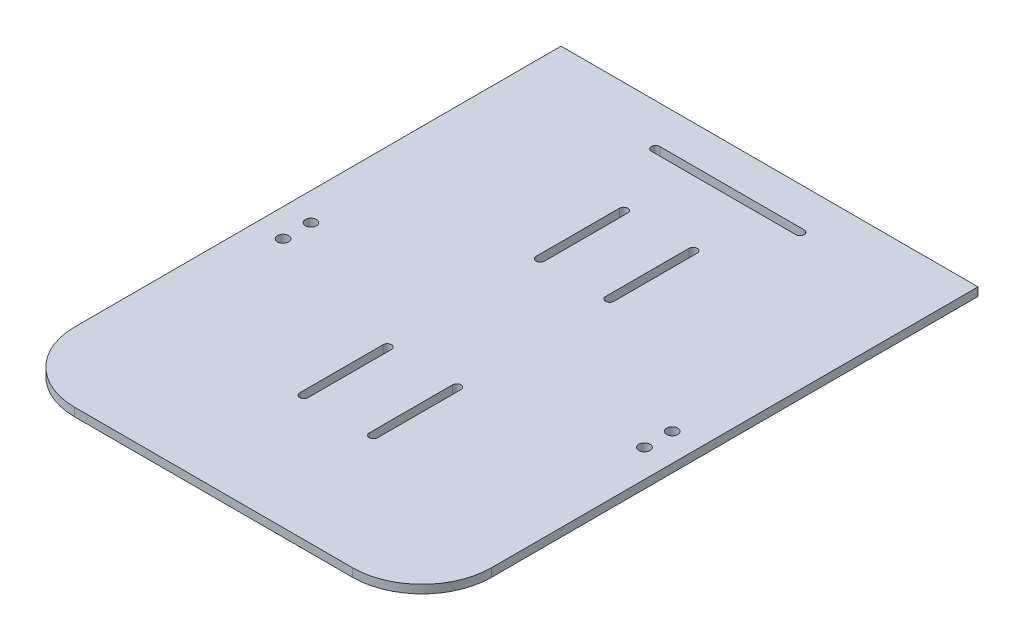
ISO-10303-21;
HEADER;
FILE_DESCRIPTION(('STEP AP214'),'2;1');
FILE_NAME('part.step','',(''),(''),'','','');
FILE_SCHEMA(('AUTOMOTIVE_DESIGN { 1 0 10303 214 1 1 1 1 }'));
ENDSEC;
DATA;
#1=APPLICATION_CONTEXT('core data for automotive mechanical design processes');
#2=APPLICATION_PROTOCOL_DEFINITION('international standard','automotive_design',2000,#1);
#3=PRODUCT_CONTEXT('',#1,'mechanical');
#4=PRODUCT('Part','Part','',(#3));
#5=PRODUCT_RELATED_PRODUCT_CATEGORY('part','',(#4));
#6=PRODUCT_DEFINITION_FORMATION('','',#4);
#7=PRODUCT_DEFINITION_CONTEXT('part definition',#1,'design');
#8=PRODUCT_DEFINITION('design','',#6,#7);
#9=PRODUCT_DEFINITION_SHAPE('','',#8);
#10=(LENGTH_UNIT() NAMED_UNIT(*) SI_UNIT(.MILLI.,.METRE.));
#11=(NAMED_UNIT(*) PLANE_ANGLE_UNIT() SI_UNIT($,.RADIAN.));
#12=(NAMED_UNIT(*) SI_UNIT($,.STERADIAN.) SOLID_ANGLE_UNIT());
#13=UNCERTAINTY_MEASURE_WITH_UNIT(LENGTH_MEASURE(1.E-05),#10,'distance_accuracy_value','');
#14=(GEOMETRIC_REPRESENTATION_CONTEXT(3) GLOBAL_UNCERTAINTY_ASSIGNED_CONTEXT((#13)) GLOBAL_UNIT_ASSIGNED_CONTEXT((#10,
#11,#12)) REPRESENTATION_CONTEXT('',''));
#15=CARTESIAN_POINT('',(0.,0.,0.));
#16=DIRECTION('',(0.,0.,1.));
#17=DIRECTION('',(1.,0.,0.));
#18=AXIS2_PLACEMENT_3D('',#15,#16,#17);
#19=CARTESIAN_POINT('',(-11.,3.,0.));
#20=DIRECTION('',(1.,0.,0.));
#21=DIRECTION('',(0.,0.,-1.));
#22=AXIS2_PLACEMENT_3D('',#19,#20,#21);
#23=PLANE('',#22);
#24=DIRECTION('',(0.,0.,1.));
#25=VECTOR('',#24,1.);
#26=CARTESIAN_POINT('',(-11.,0.,0.));
#27=LINE('',#26,#25);
#28=CARTESIAN_POINT('',(-11.,0.,-160.));
#29=VERTEX_POINT('',#28);
#30=CARTESIAN_POINT('',(-11.,0.,-130.));
#31=VERTEX_POINT('',#30);
#32=EDGE_CURVE('E314',#29,#31,#27,.T.);
#33=ORIENTED_EDGE('',*,*,#32,.T.);
#34=DIRECTION('',(0.,-1.,0.));
#35=VECTOR('',#34,1.);
#36=CARTESIAN_POINT('',(-11.,3.,-130.));
#37=LINE('',#36,#35);
#38=CARTESIAN_POINT('',(-11.,3.,-130.));
#39=VERTEX_POINT('',#38);
#40=EDGE_CURVE('E11',#39,#31,#37,.T.);
#41=ORIENTED_EDGE('',*,*,#40,.F.);
#42=DIRECTION('',(0.,0.,1.));
#43=VECTOR('',#42,1.);
#44=CARTESIAN_POINT('',(-11.,3.,0.));
#45=LINE('',#44,#43);
#46=CARTESIAN_POINT('',(-11.,3.,-160.));
#47=VERTEX_POINT('',#46);
#48=EDGE_CURVE('E220',#47,#39,#45,.T.);
#49=ORIENTED_EDGE('',*,*,#48,.F.);
#50=DIRECTION('',(0.,-1.,0.));
#51=VECTOR('',#50,1.);
#52=CARTESIAN_POINT('',(-11.,3.,-160.));
#53=LINE('',#52,#51);
#54=EDGE_CURVE('E322',#47,#29,#53,.T.);
#55=ORIENTED_EDGE('',*,*,#54,.T.);
#56=EDGE_LOOP('',(#33,#41,#49,#55));
#57=FACE_BOUND('',#56,.T.);
#58=ADVANCED_FACE('F34',(#57),#23,.F.);
#59=CARTESIAN_POINT('',(-12.5,3.,-130.));
#60=DIRECTION('',(0.,-1.,0.));
#61=DIRECTION('',(0.,0.,-1.));
#62=AXIS2_PLACEMENT_3D('',#59,#60,#61);
#63=CYLINDRICAL_SURFACE('',#62,1.5);
#64=CARTESIAN_POINT('',(-12.5,0.,-130.));
#65=DIRECTION('',(0.,1.,0.));
#66=DIRECTION('',(0.,0.,1.));
#67=AXIS2_PLACEMENT_3D('',#64,#65,#66);
#68=CIRCLE('',#67,1.5);
#69=CARTESIAN_POINT('',(-14.,0.,-130.));
#70=VERTEX_POINT('',#69);
#71=EDGE_CURVE('E226',#31,#70,#68,.F.);
#72=ORIENTED_EDGE('',*,*,#71,.T.);
#73=DIRECTION('',(0.,-1.,0.));
#74=VECTOR('',#73,1.);
#75=CARTESIAN_POINT('',(-14.,3.,-130.));
#76=LINE('',#75,#74);
#77=CARTESIAN_POINT('',(-14.,3.,-130.));
#78=VERTEX_POINT('',#77);
#79=EDGE_CURVE('E44',#78,#70,#76,.T.);
#80=ORIENTED_EDGE('',*,*,#79,.F.);
#81=CARTESIAN_POINT('',(-12.5,3.,-130.));
#82=DIRECTION('',(0.,1.,0.));
#83=DIRECTION('',(0.,0.,1.));
#84=AXIS2_PLACEMENT_3D('',#81,#82,#83);
#85=CIRCLE('',#84,1.5);
#86=EDGE_CURVE('E214',#39,#78,#85,.F.);
#87=ORIENTED_EDGE('',*,*,#86,.F.);
#88=ORIENTED_EDGE('',*,*,#40,.T.);
#89=EDGE_LOOP('',(#72,#80,#87,#88));
#90=FACE_BOUND('',#89,.T.);
#91=ADVANCED_FACE('F225',(#90),#63,.F.);
#92=CARTESIAN_POINT('',(-14.,3.,0.));
#93=DIRECTION('',(1.,0.,0.));
#94=DIRECTION('',(0.,0.,-1.));
#95=AXIS2_PLACEMENT_3D('',#92,#93,#94);
#96=PLANE('',#95);
#97=DIRECTION('',(0.,0.,1.));
#98=VECTOR('',#97,1.);
#99=CARTESIAN_POINT('',(-14.,0.,0.));
#100=LINE('',#99,#98);
#101=CARTESIAN_POINT('',(-14.,0.,-160.));
#102=VERTEX_POINT('',#101);
#103=EDGE_CURVE('E318',#102,#70,#100,.T.);
#104=ORIENTED_EDGE('',*,*,#103,.F.);
#105=DIRECTION('',(0.,-1.,0.));
#106=VECTOR('',#105,1.);
#107=CARTESIAN_POINT('',(-14.,3.,-160.));
#108=LINE('',#107,#106);
#109=CARTESIAN_POINT('',(-14.,3.,-160.));
#110=VERTEX_POINT('',#109);
#111=EDGE_CURVE('E135',#110,#102,#108,.T.);
#112=ORIENTED_EDGE('',*,*,#111,.F.);
#113=DIRECTION('',(0.,0.,1.));
#114=VECTOR('',#113,1.);
#115=CARTESIAN_POINT('',(-14.,3.,0.));
#116=LINE('',#115,#114);
#117=EDGE_CURVE('E218',#110,#78,#116,.T.);
#118=ORIENTED_EDGE('',*,*,#117,.T.);
#119=ORIENTED_EDGE('',*,*,#79,.T.);
#120=EDGE_LOOP('',(#104,#112,#118,#119));
#121=FACE_BOUND('',#120,.T.);
#122=ADVANCED_FACE('F231',(#121),#96,.T.);
#123=CARTESIAN_POINT('',(25.9779421907018,3.,-185.));
#124=DIRECTION('',(0.,-1.,0.));
#125=DIRECTION('',(0.,0.,-1.));
#126=AXIS2_PLACEMENT_3D('',#123,#124,#125);
#127=CYLINDRICAL_SURFACE('',#126,1.5);
#128=CARTESIAN_POINT('',(25.9779421907018,0.,-185.));
#129=DIRECTION('',(0.,1.,0.));
#130=DIRECTION('',(0.,0.,1.));
#131=AXIS2_PLACEMENT_3D('',#128,#129,#130);
#132=CIRCLE('',#131,1.5);
#133=CARTESIAN_POINT('',(25.9779421907018,0.,-183.5));
#134=VERTEX_POINT('',#133);
#135=CARTESIAN_POINT('',(25.9779421907018,0.,-186.5));
#136=VERTEX_POINT('',#135);
#137=EDGE_CURVE('E299',#134,#136,#132,.T.);
#138=ORIENTED_EDGE('',*,*,#137,.F.);
#139=DIRECTION('',(0.,-1.,0.));
#140=VECTOR('',#139,1.);
#141=CARTESIAN_POINT('',(25.9779421907018,3.,-183.5));
#142=LINE('',#141,#140);
#143=CARTESIAN_POINT('',(25.9779421907018,3.,-183.5));
#144=VERTEX_POINT('',#143);
#145=EDGE_CURVE('E324',#144,#134,#142,.T.);
#146=ORIENTED_EDGE('',*,*,#145,.F.);
#147=CARTESIAN_POINT('',(25.9779421907018,3.,-185.));
#148=DIRECTION('',(0.,1.,0.));
#149=DIRECTION('',(0.,0.,1.));
#150=AXIS2_PLACEMENT_3D('',#147,#148,#149);
#151=CIRCLE('',#150,1.5);
#152=CARTESIAN_POINT('',(25.9779421907018,3.,-186.5));
#153=VERTEX_POINT('',#152);
#154=EDGE_CURVE('E442',#144,#153,#151,.T.);
#155=ORIENTED_EDGE('',*,*,#154,.T.);
#156=DIRECTION('',(0.,-1.,0.));
#157=VECTOR('',#156,1.);
#158=CARTESIAN_POINT('',(25.9779421907018,3.,-186.5));
#159=LINE('',#158,#157);
#160=EDGE_CURVE('E326',#153,#136,#159,.T.);
#161=ORIENTED_EDGE('',*,*,#160,.T.);
#162=EDGE_LOOP('',(#138,#146,#155,#161));
#163=FACE_BOUND('',#162,.T.);
#164=ADVANCED_FACE('F500',(#163),#127,.F.);
#165=CARTESIAN_POINT('',(0.,3.,-183.5));
#166=DIRECTION('',(0.,0.,-1.));
#167=DIRECTION('',(-1.,0.,0.));
#168=AXIS2_PLACEMENT_3D('',#165,#166,#167);
#169=PLANE('',#168);
#170=DIRECTION('',(1.,0.,0.));
#171=VECTOR('',#170,1.);
#172=CARTESIAN_POINT('',(0.,0.,-183.5));
#173=LINE('',#172,#171);
#174=CARTESIAN_POINT('',(-25.9779421907018,0.,-183.5));
#175=VERTEX_POINT('',#174);
#176=EDGE_CURVE('E302',#175,#134,#173,.T.);
#177=ORIENTED_EDGE('',*,*,#176,.F.);
#178=DIRECTION('',(0.,-1.,0.));
#179=VECTOR('',#178,1.);
#180=CARTESIAN_POINT('',(-25.9779421907018,3.,-183.5));
#181=LINE('',#180,#179);
#182=CARTESIAN_POINT('',(-25.9779421907018,3.,-183.5));
#183=VERTEX_POINT('',#182);
#184=EDGE_CURVE('E331',#183,#175,#181,.T.);
#185=ORIENTED_EDGE('',*,*,#184,.F.);
#186=DIRECTION('',(1.,0.,0.));
#187=VECTOR('',#186,1.);
#188=CARTESIAN_POINT('',(0.,3.,-183.5));
#189=LINE('',#188,#187);
#190=EDGE_CURVE('E445',#183,#144,#189,.T.);
#191=ORIENTED_EDGE('',*,*,#190,.T.);
#192=ORIENTED_EDGE('',*,*,#145,.T.);
#193=EDGE_LOOP('',(#177,#185,#191,#192));
#194=FACE_BOUND('',#193,.T.);
#195=ADVANCED_FACE('F496',(#194),#169,.T.);
#196=CARTESIAN_POINT('',(-25.9779421907018,3.,-185.));
#197=DIRECTION('',(0.,-1.,0.));
#198=DIRECTION('',(0.,0.,-1.));
#199=AXIS2_PLACEMENT_3D('',#196,#197,#198);
#200=CYLINDRICAL_SURFACE('',#199,1.5);
#201=CARTESIAN_POINT('',(-25.9779421907018,0.,-185.));
#202=DIRECTION('',(0.,1.,0.));
#203=DIRECTION('',(0.,0.,1.));
#204=AXIS2_PLACEMENT_3D('',#201,#202,#203);
#205=CIRCLE('',#204,1.5);
#206=CARTESIAN_POINT('',(-25.9779421907018,0.,-186.5));
#207=VERTEX_POINT('',#206);
#208=EDGE_CURVE('E305',#207,#175,#205,.T.);
#209=ORIENTED_EDGE('',*,*,#208,.F.);
#210=DIRECTION('',(0.,-1.,0.));
#211=VECTOR('',#210,1.);
#212=CARTESIAN_POINT('',(-25.9779421907018,3.,-186.5));
#213=LINE('',#212,#211);
#214=CARTESIAN_POINT('',(-25.9779421907018,3.,-186.5));
#215=VERTEX_POINT('',#214);
#216=EDGE_CURVE('E328',#215,#207,#213,.T.);
#217=ORIENTED_EDGE('',*,*,#216,.F.);
#218=CARTESIAN_POINT('',(-25.9779421907018,3.,-185.));
#219=DIRECTION('',(0.,1.,0.));
#220=DIRECTION('',(0.,0.,1.));
#221=AXIS2_PLACEMENT_3D('',#218,#219,#220);
#222=CIRCLE('',#221,1.5);
#223=EDGE_CURVE('E448',#215,#183,#222,.T.);
#224=ORIENTED_EDGE('',*,*,#223,.T.);
#225=ORIENTED_EDGE('',*,*,#184,.T.);
#226=EDGE_LOOP('',(#209,#217,#224,#225));
#227=FACE_BOUND('',#226,.T.);
#228=ADVANCED_FACE('F492',(#227),#200,.F.);
#229=CARTESIAN_POINT('',(12.5,3.,-130.));
#230=DIRECTION('',(0.,-1.,0.));
#231=DIRECTION('',(0.,0.,-1.));
#232=AXIS2_PLACEMENT_3D('',#229,#230,#231);
#233=CYLINDRICAL_SURFACE('',#232,1.5);
#234=CARTESIAN_POINT('',(12.5,0.,-130.));
#235=DIRECTION('',(0.,1.,0.));
#236=DIRECTION('',(0.,0.,1.));
#237=AXIS2_PLACEMENT_3D('',#234,#235,#236);
#238=CIRCLE('',#237,1.5);
#239=CARTESIAN_POINT('',(11.,0.,-130.));
#240=VERTEX_POINT('',#239);
#241=CARTESIAN_POINT('',(14.,0.,-130.));
#242=VERTEX_POINT('',#241);
#243=EDGE_CURVE('E281',#240,#242,#238,.T.);
#244=ORIENTED_EDGE('',*,*,#243,.F.);
#245=DIRECTION('',(0.,-1.,0.));
#246=VECTOR('',#245,1.);
#247=CARTESIAN_POINT('',(11.,3.,-130.));
#248=LINE('',#247,#246);
#249=CARTESIAN_POINT('',(11.,3.,-130.));
#250=VERTEX_POINT('',#249);
#251=EDGE_CURVE('E329',#250,#240,#248,.T.);
#252=ORIENTED_EDGE('',*,*,#251,.F.);
#253=CARTESIAN_POINT('',(12.5,3.,-130.));
#254=DIRECTION('',(0.,1.,0.));
#255=DIRECTION('',(0.,0.,1.));
#256=AXIS2_PLACEMENT_3D('',#253,#254,#255);
#257=CIRCLE('',#256,1.5);
#258=CARTESIAN_POINT('',(14.,3.,-130.));
#259=VERTEX_POINT('',#258);
#260=EDGE_CURVE('E425',#250,#259,#257,.T.);
#261=ORIENTED_EDGE('',*,*,#260,.T.);
#262=DIRECTION('',(0.,-1.,0.));
#263=VECTOR('',#262,1.);
#264=CARTESIAN_POINT('',(14.,3.,-130.));
#265=LINE('',#264,#263);
#266=EDGE_CURVE('E334',#259,#242,#265,.T.);
#267=ORIENTED_EDGE('',*,*,#266,.T.);
#268=EDGE_LOOP('',(#244,#252,#261,#267));
#269=FACE_BOUND('',#268,.T.);
#270=ADVANCED_FACE('F495',(#269),#233,.F.);
#271=CARTESIAN_POINT('',(11.,3.,0.));
#272=DIRECTION('',(1.,0.,0.));
#273=DIRECTION('',(0.,0.,-1.));
#274=AXIS2_PLACEMENT_3D('',#271,#272,#273);
#275=PLANE('',#274);
#276=DIRECTION('',(0.,0.,1.));
#277=VECTOR('',#276,1.);
#278=CARTESIAN_POINT('',(11.,0.,0.));
#279=LINE('',#278,#277);
#280=CARTESIAN_POINT('',(11.,0.,-160.));
#281=VERTEX_POINT('',#280);
#282=EDGE_CURVE('E284',#281,#240,#279,.T.);
#283=ORIENTED_EDGE('',*,*,#282,.F.);
#284=DIRECTION('',(0.,-1.,0.));
#285=VECTOR('',#284,1.);
#286=CARTESIAN_POINT('',(11.,3.,-160.));
#287=LINE('',#286,#285);
#288=CARTESIAN_POINT('',(11.,3.,-160.));
#289=VERTEX_POINT('',#288);
#290=EDGE_CURVE('E339',#289,#281,#287,.T.);
#291=ORIENTED_EDGE('',*,*,#290,.F.);
#292=DIRECTION('',(0.,0.,1.));
#293=VECTOR('',#292,1.);
#294=CARTESIAN_POINT('',(11.,3.,0.));
#295=LINE('',#294,#293);
#296=EDGE_CURVE('E428',#289,#250,#295,.T.);
#297=ORIENTED_EDGE('',*,*,#296,.T.);
#298=ORIENTED_EDGE('',*,*,#251,.T.);
#299=EDGE_LOOP('',(#283,#291,#297,#298));
#300=FACE_BOUND('',#299,.T.);
#301=ADVANCED_FACE('F521',(#300),#275,.T.);
#302=CARTESIAN_POINT('',(12.5,3.,-160.));
#303=DIRECTION('',(0.,-1.,0.));
#304=DIRECTION('',(0.,0.,-1.));
#305=AXIS2_PLACEMENT_3D('',#302,#303,#304);
#306=CYLINDRICAL_SURFACE('',#305,1.5);
#307=CARTESIAN_POINT('',(12.5,0.,-160.));
#308=DIRECTION('',(0.,1.,0.));
#309=DIRECTION('',(0.,0.,1.));
#310=AXIS2_PLACEMENT_3D('',#307,#308,#309);
#311=CIRCLE('',#310,1.5);
#312=CARTESIAN_POINT('',(14.,0.,-160.));
#313=VERTEX_POINT('',#312);
#314=EDGE_CURVE('E287',#313,#281,#311,.T.);
#315=ORIENTED_EDGE('',*,*,#314,.F.);
#316=DIRECTION('',(0.,-1.,0.));
#317=VECTOR('',#316,1.);
#318=CARTESIAN_POINT('',(14.,3.,-160.));
#319=LINE('',#318,#317);
#320=CARTESIAN_POINT('',(14.,3.,-160.));
#321=VERTEX_POINT('',#320);
#322=EDGE_CURVE('E336',#321,#313,#319,.T.);
#323=ORIENTED_EDGE('',*,*,#322,.F.);
#324=CARTESIAN_POINT('',(12.5,3.,-160.));
#325=DIRECTION('',(0.,1.,0.));
#326=DIRECTION('',(0.,0.,1.));
#327=AXIS2_PLACEMENT_3D('',#324,#325,#326);
#328=CIRCLE('',#327,1.5);
#329=EDGE_CURVE('E431',#321,#289,#328,.T.);
#330=ORIENTED_EDGE('',*,*,#329,.T.);
#331=ORIENTED_EDGE('',*,*,#290,.T.);
#332=EDGE_LOOP('',(#315,#323,#330,#331));
#333=FACE_BOUND('',#332,.T.);
#334=ADVANCED_FACE('F517',(#333),#306,.F.);
#335=CARTESIAN_POINT('',(12.5,3.,-45.));
#336=DIRECTION('',(0.,-1.,0.));
#337=DIRECTION('',(0.,0.,-1.));
#338=AXIS2_PLACEMENT_3D('',#335,#336,#337);
#339=CYLINDRICAL_SURFACE('',#338,1.5);
#340=CARTESIAN_POINT('',(12.5,0.,-45.));
#341=DIRECTION('',(0.,1.,0.));
#342=DIRECTION('',(0.,0.,1.));
#343=AXIS2_PLACEMENT_3D('',#340,#341,#342);
#344=CIRCLE('',#343,1.5);
#345=CARTESIAN_POINT('',(11.,0.,-45.));
#346=VERTEX_POINT('',#345);
#347=CARTESIAN_POINT('',(14.,0.,-45.));
#348=VERTEX_POINT('',#347);
#349=EDGE_CURVE('E269',#346,#348,#344,.T.);
#350=ORIENTED_EDGE('',*,*,#349,.F.);
#351=DIRECTION('',(0.,-1.,0.));
#352=VECTOR('',#351,1.);
#353=CARTESIAN_POINT('',(11.,3.,-45.));
#354=LINE('',#353,#352);
#355=CARTESIAN_POINT('',(11.,3.,-45.));
#356=VERTEX_POINT('',#355);
#357=EDGE_CURVE('E337',#356,#346,#354,.T.);
#358=ORIENTED_EDGE('',*,*,#357,.F.);
#359=CARTESIAN_POINT('',(12.5,3.,-45.));
#360=DIRECTION('',(0.,1.,0.));
#361=DIRECTION('',(0.,0.,1.));
#362=AXIS2_PLACEMENT_3D('',#359,#360,#361);
#363=CIRCLE('',#362,1.5);
#364=CARTESIAN_POINT('',(14.,3.,-45.));
#365=VERTEX_POINT('',#364);
#366=EDGE_CURVE('E414',#356,#365,#363,.T.);
#367=ORIENTED_EDGE('',*,*,#366,.T.);
#368=DIRECTION('',(0.,-1.,0.));
#369=VECTOR('',#368,1.);
#370=CARTESIAN_POINT('',(14.,3.,-45.));
#371=LINE('',#370,#369);
#372=EDGE_CURVE('E342',#365,#348,#371,.T.);
#373=ORIENTED_EDGE('',*,*,#372,.T.);
#374=EDGE_LOOP('',(#350,#358,#367,#373));
#375=FACE_BOUND('',#374,.T.);
#376=ADVANCED_FACE('F520',(#375),#339,.F.);
#377=CARTESIAN_POINT('',(11.,3.,0.));
#378=DIRECTION('',(1.,0.,0.));
#379=DIRECTION('',(0.,0.,-1.));
#380=AXIS2_PLACEMENT_3D('',#377,#378,#379);
#381=PLANE('',#380);
#382=DIRECTION('',(0.,0.,1.));
#383=VECTOR('',#382,1.);
#384=CARTESIAN_POINT('',(11.,0.,0.));
#385=LINE('',#384,#383);
#386=CARTESIAN_POINT('',(11.,0.,-75.));
#387=VERTEX_POINT('',#386);
#388=EDGE_CURVE('E272',#387,#346,#385,.T.);
#389=ORIENTED_EDGE('',*,*,#388,.F.);
#390=DIRECTION('',(0.,-1.,0.));
#391=VECTOR('',#390,1.);
#392=CARTESIAN_POINT('',(11.,3.,-75.));
#393=LINE('',#392,#391);
#394=CARTESIAN_POINT('',(11.,3.,-75.));
#395=VERTEX_POINT('',#394);
#396=EDGE_CURVE('E347',#395,#387,#393,.T.);
#397=ORIENTED_EDGE('',*,*,#396,.F.);
#398=DIRECTION('',(0.,0.,1.));
#399=VECTOR('',#398,1.);
#400=CARTESIAN_POINT('',(11.,3.,0.));
#401=LINE('',#400,#399);
#402=EDGE_CURVE('E417',#395,#356,#401,.T.);
#403=ORIENTED_EDGE('',*,*,#402,.T.);
#404=ORIENTED_EDGE('',*,*,#357,.T.);
#405=EDGE_LOOP('',(#389,#397,#403,#404));
#406=FACE_BOUND('',#405,.T.);
#407=ADVANCED_FACE('F537',(#406),#381,.T.);
#408=CARTESIAN_POINT('',(12.5,3.,-75.));
#409=DIRECTION('',(0.,-1.,0.));
#410=DIRECTION('',(0.,0.,-1.));
#411=AXIS2_PLACEMENT_3D('',#408,#409,#410);
#412=CYLINDRICAL_SURFACE('',#411,1.5);
#413=CARTESIAN_POINT('',(12.5,0.,-75.));
#414=DIRECTION('',(0.,1.,0.));
#415=DIRECTION('',(0.,0.,1.));
#416=AXIS2_PLACEMENT_3D('',#413,#414,#415);
#417=CIRCLE('',#416,1.5);
#418=CARTESIAN_POINT('',(14.,0.,-75.));
#419=VERTEX_POINT('',#418);
#420=EDGE_CURVE('E275',#419,#387,#417,.T.);
#421=ORIENTED_EDGE('',*,*,#420,.F.);
#422=DIRECTION('',(0.,-1.,0.));
#423=VECTOR('',#422,1.);
#424=CARTESIAN_POINT('',(14.,3.,-75.));
#425=LINE('',#424,#423);
#426=CARTESIAN_POINT('',(14.,3.,-75.));
#427=VERTEX_POINT('',#426);
#428=EDGE_CURVE('E344',#427,#419,#425,.T.);
#429=ORIENTED_EDGE('',*,*,#428,.F.);
#430=CARTESIAN_POINT('',(12.5,3.,-75.));
#431=DIRECTION('',(0.,1.,0.));
#432=DIRECTION('',(0.,0.,1.));
#433=AXIS2_PLACEMENT_3D('',#430,#431,#432);
#434=CIRCLE('',#433,1.5);
#435=EDGE_CURVE('E420',#427,#395,#434,.T.);
#436=ORIENTED_EDGE('',*,*,#435,.T.);
#437=ORIENTED_EDGE('',*,*,#396,.T.);
#438=EDGE_LOOP('',(#421,#429,#436,#437));
#439=FACE_BOUND('',#438,.T.);
#440=ADVANCED_FACE('F533',(#439),#412,.F.);
#441=CARTESIAN_POINT('',(-50.,3.,-25.));
#442=DIRECTION('',(0.,-1.,0.));
#443=DIRECTION('',(0.,0.,-1.));
#444=AXIS2_PLACEMENT_3D('',#441,#442,#443);
#445=CYLINDRICAL_SURFACE('',#444,25.);
#446=CARTESIAN_POINT('',(-50.,0.,-25.));
#447=DIRECTION('',(0.,1.,0.));
#448=DIRECTION('',(0.,0.,1.));
#449=AXIS2_PLACEMENT_3D('',#446,#447,#448);
#450=CIRCLE('',#449,25.);
#451=CARTESIAN_POINT('',(-49.9999999999998,0.,0.));
#452=VERTEX_POINT('',#451);
#453=CARTESIAN_POINT('',(-75.,0.,-25.0000000000002));
#454=VERTEX_POINT('',#453);
#455=EDGE_CURVE('E251',#452,#454,#450,.F.);
#456=ORIENTED_EDGE('',*,*,#455,.F.);
#457=DIRECTION('',(0.,-1.,0.));
#458=VECTOR('',#457,1.);
#459=CARTESIAN_POINT('',(-49.9999999999998,3.,0.));
#460=LINE('',#459,#458);
#461=CARTESIAN_POINT('',(-49.9999999999998,3.,0.));
#462=VERTEX_POINT('',#461);
#463=EDGE_CURVE('E345',#462,#452,#460,.T.);
#464=ORIENTED_EDGE('',*,*,#463,.F.);
#465=CARTESIAN_POINT('',(-50.,3.,-25.));
#466=DIRECTION('',(0.,1.,0.));
#467=DIRECTION('',(0.,0.,1.));
#468=AXIS2_PLACEMENT_3D('',#465,#466,#467);
#469=CIRCLE('',#468,25.);
#470=CARTESIAN_POINT('',(-75.,3.,-25.0000000000002));
#471=VERTEX_POINT('',#470);
#472=EDGE_CURVE('E397',#462,#471,#469,.F.);
#473=ORIENTED_EDGE('',*,*,#472,.T.);
#474=DIRECTION('',(0.,-1.,0.));
#475=VECTOR('',#474,1.);
#476=CARTESIAN_POINT('',(-75.,3.,-25.0000000000002));
#477=LINE('',#476,#475);
#478=EDGE_CURVE('E350',#471,#454,#477,.T.);
#479=ORIENTED_EDGE('',*,*,#478,.T.);
#480=EDGE_LOOP('',(#456,#464,#473,#479));
#481=FACE_BOUND('',#480,.T.);
#482=ADVANCED_FACE('F536',(#481),#445,.T.);
#483=CARTESIAN_POINT('',(0.,3.,0.));
#484=DIRECTION('',(0.,0.,-1.));
#485=DIRECTION('',(-1.,0.,0.));
#486=AXIS2_PLACEMENT_3D('',#483,#484,#485);
#487=PLANE('',#486);
#488=DIRECTION('',(1.,0.,0.));
#489=VECTOR('',#488,1.);
#490=CARTESIAN_POINT('',(0.,0.,0.));
#491=LINE('',#490,#489);
#492=CARTESIAN_POINT('',(49.9999999999998,0.,0.));
#493=VERTEX_POINT('',#492);
#494=EDGE_CURVE('E254',#452,#493,#491,.T.);
#495=ORIENTED_EDGE('',*,*,#494,.T.);
#496=DIRECTION('',(0.,-1.,0.));
#497=VECTOR('',#496,1.);
#498=CARTESIAN_POINT('',(49.9999999999998,3.,0.));
#499=LINE('',#498,#497);
#500=CARTESIAN_POINT('',(49.9999999999998,3.,0.));
#501=VERTEX_POINT('',#500);
#502=EDGE_CURVE('E359',#501,#493,#499,.T.);
#503=ORIENTED_EDGE('',*,*,#502,.F.);
#504=DIRECTION('',(1.,0.,0.));
#505=VECTOR('',#504,1.);
#506=CARTESIAN_POINT('',(0.,3.,0.));
#507=LINE('',#506,#505);
#508=EDGE_CURVE('E400',#462,#501,#507,.T.);
#509=ORIENTED_EDGE('',*,*,#508,.F.);
#510=ORIENTED_EDGE('',*,*,#463,.T.);
#511=EDGE_LOOP('',(#495,#503,#509,#510));
#512=FACE_BOUND('',#511,.T.);
#513=ADVANCED_FACE('F559',(#512),#487,.F.);
#514=CARTESIAN_POINT('',(50.,3.,-25.));
#515=DIRECTION('',(0.,-1.,0.));
#516=DIRECTION('',(0.,0.,-1.));
#517=AXIS2_PLACEMENT_3D('',#514,#515,#516);
#518=CYLINDRICAL_SURFACE('',#517,25.);
#519=CARTESIAN_POINT('',(50.,0.,-25.));
#520=DIRECTION('',(0.,1.,0.));
#521=DIRECTION('',(0.,0.,1.));
#522=AXIS2_PLACEMENT_3D('',#519,#520,#521);
#523=CIRCLE('',#522,25.);
#524=CARTESIAN_POINT('',(75.,0.,-25.0000000000002));
#525=VERTEX_POINT('',#524);
#526=EDGE_CURVE('E257',#493,#525,#523,.T.);
#527=ORIENTED_EDGE('',*,*,#526,.T.);
#528=DIRECTION('',(0.,-1.,0.));
#529=VECTOR('',#528,1.);
#530=CARTESIAN_POINT('',(75.,3.,-25.0000000000002));
#531=LINE('',#530,#529);
#532=CARTESIAN_POINT('',(75.,3.,-25.0000000000002));
#533=VERTEX_POINT('',#532);
#534=EDGE_CURVE('E356',#533,#525,#531,.T.);
#535=ORIENTED_EDGE('',*,*,#534,.F.);
#536=CARTESIAN_POINT('',(50.,3.,-25.));
#537=DIRECTION('',(0.,1.,0.));
#538=DIRECTION('',(0.,0.,1.));
#539=AXIS2_PLACEMENT_3D('',#536,#537,#538);
#540=CIRCLE('',#539,25.);
#541=EDGE_CURVE('E403',#501,#533,#540,.T.);
#542=ORIENTED_EDGE('',*,*,#541,.F.);
#543=ORIENTED_EDGE('',*,*,#502,.T.);
#544=EDGE_LOOP('',(#527,#535,#542,#543));
#545=FACE_BOUND('',#544,.T.);
#546=ADVANCED_FACE('F555',(#545),#518,.T.);
#547=CARTESIAN_POINT('',(75.,3.,0.));
#548=DIRECTION('',(-1.,0.,0.));
#549=DIRECTION('',(0.,0.,1.));
#550=AXIS2_PLACEMENT_3D('',#547,#548,#549);
#551=PLANE('',#550);
#552=DIRECTION('',(0.,0.,-1.));
#553=VECTOR('',#552,1.);
#554=CARTESIAN_POINT('',(75.,0.,0.));
#555=LINE('',#554,#553);
#556=CARTESIAN_POINT('',(75.,0.,-200.));
#557=VERTEX_POINT('',#556);
#558=EDGE_CURVE('E260',#525,#557,#555,.T.);
#559=ORIENTED_EDGE('',*,*,#558,.T.);
#560=DIRECTION('',(0.,-1.,0.));
#561=VECTOR('',#560,1.);
#562=CARTESIAN_POINT('',(75.,3.,-200.));
#563=LINE('',#562,#561);
#564=CARTESIAN_POINT('',(75.,3.,-200.));
#565=VERTEX_POINT('',#564);
#566=EDGE_CURVE('E354',#565,#557,#563,.T.);
#567=ORIENTED_EDGE('',*,*,#566,.F.);
#568=DIRECTION('',(0.,0.,-1.));
#569=VECTOR('',#568,1.);
#570=CARTESIAN_POINT('',(75.,3.,0.));
#571=LINE('',#570,#569);
#572=EDGE_CURVE('E406',#533,#565,#571,.T.);
#573=ORIENTED_EDGE('',*,*,#572,.F.);
#574=ORIENTED_EDGE('',*,*,#534,.T.);
#575=EDGE_LOOP('',(#559,#567,#573,#574));
#576=FACE_BOUND('',#575,.T.);
#577=ADVANCED_FACE('F551',(#576),#551,.F.);
#578=CARTESIAN_POINT('',(0.,3.,-200.));
#579=DIRECTION('',(0.,0.,-1.));
#580=DIRECTION('',(-1.,0.,0.));
#581=AXIS2_PLACEMENT_3D('',#578,#579,#580);
#582=PLANE('',#581);
#583=DIRECTION('',(1.,0.,0.));
#584=VECTOR('',#583,1.);
#585=CARTESIAN_POINT('',(0.,0.,-200.));
#586=LINE('',#585,#584);
#587=CARTESIAN_POINT('',(-75.,0.,-200.));
#588=VERTEX_POINT('',#587);
#589=EDGE_CURVE('E263',#588,#557,#586,.T.);
#590=ORIENTED_EDGE('',*,*,#589,.F.);
#591=DIRECTION('',(0.,-1.,0.));
#592=VECTOR('',#591,1.);
#593=CARTESIAN_POINT('',(-75.,3.,-200.));
#594=LINE('',#593,#592);
#595=CARTESIAN_POINT('',(-75.,3.,-200.));
#596=VERTEX_POINT('',#595);
#597=EDGE_CURVE('E352',#596,#588,#594,.T.);
#598=ORIENTED_EDGE('',*,*,#597,.F.);
#599=DIRECTION('',(1.,0.,0.));
#600=VECTOR('',#599,1.);
#601=CARTESIAN_POINT('',(0.,3.,-200.));
#602=LINE('',#601,#600);
#603=EDGE_CURVE('E408',#596,#565,#602,.T.);
#604=ORIENTED_EDGE('',*,*,#603,.T.);
#605=ORIENTED_EDGE('',*,*,#566,.T.);
#606=EDGE_LOOP('',(#590,#598,#604,#605));
#607=FACE_BOUND('',#606,.T.);
#608=ADVANCED_FACE('F548',(#607),#582,.T.);
#609=CARTESIAN_POINT('',(-11.,3.,0.));
#610=DIRECTION('',(1.,0.,0.));
#611=DIRECTION('',(0.,0.,-1.));
#612=AXIS2_PLACEMENT_3D('',#609,#610,#611);
#613=PLANE('',#612);
#614=DIRECTION('',(0.,0.,1.));
#615=VECTOR('',#614,1.);
#616=CARTESIAN_POINT('',(-11.,0.,0.));
#617=LINE('',#616,#615);
#618=CARTESIAN_POINT('',(-11.,0.,-75.));
#619=VERTEX_POINT('',#618);
#620=CARTESIAN_POINT('',(-11.,0.,-45.));
#621=VERTEX_POINT('',#620);
#622=EDGE_CURVE('E237',#619,#621,#617,.T.);
#623=ORIENTED_EDGE('',*,*,#622,.T.);
#624=DIRECTION('',(0.,-1.,0.));
#625=VECTOR('',#624,1.);
#626=CARTESIAN_POINT('',(-11.,3.,-45.));
#627=LINE('',#626,#625);
#628=CARTESIAN_POINT('',(-11.,3.,-45.));
#629=VERTEX_POINT('',#628);
#630=EDGE_CURVE('E38',#629,#621,#627,.T.);
#631=ORIENTED_EDGE('',*,*,#630,.F.);
#632=DIRECTION('',(0.,0.,1.));
#633=VECTOR('',#632,1.);
#634=CARTESIAN_POINT('',(-11.,3.,0.));
#635=LINE('',#634,#633);
#636=CARTESIAN_POINT('',(-11.,3.,-75.));
#637=VERTEX_POINT('',#636);
#638=EDGE_CURVE('E321',#637,#629,#635,.T.);
#639=ORIENTED_EDGE('',*,*,#638,.F.);
#640=DIRECTION('',(0.,-1.,0.));
#641=VECTOR('',#640,1.);
#642=CARTESIAN_POINT('',(-11.,3.,-75.));
#643=LINE('',#642,#641);
#644=EDGE_CURVE('E233',#637,#619,#643,.T.);
#645=ORIENTED_EDGE('',*,*,#644,.T.);
#646=EDGE_LOOP('',(#623,#631,#639,#645));
#647=FACE_BOUND('',#646,.T.);
#648=ADVANCED_FACE('F36',(#647),#613,.F.);
#649=CARTESIAN_POINT('',(-12.5,3.,-45.));
#650=DIRECTION('',(0.,-1.,0.));
#651=DIRECTION('',(0.,0.,-1.));
#652=AXIS2_PLACEMENT_3D('',#649,#650,#651);
#653=CYLINDRICAL_SURFACE('',#652,1.5);
#654=CARTESIAN_POINT('',(-12.5,0.,-45.));
#655=DIRECTION('',(0.,1.,0.));
#656=DIRECTION('',(0.,0.,1.));
#657=AXIS2_PLACEMENT_3D('',#654,#655,#656);
#658=CIRCLE('',#657,1.5);
#659=CARTESIAN_POINT('',(-14.,0.,-45.));
#660=VERTEX_POINT('',#659);
#661=EDGE_CURVE('E240',#621,#660,#658,.F.);
#662=ORIENTED_EDGE('',*,*,#661,.T.);
#663=DIRECTION('',(0.,-1.,0.));
#664=VECTOR('',#663,1.);
#665=CARTESIAN_POINT('',(-14.,3.,-45.));
#666=LINE('',#665,#664);
#667=CARTESIAN_POINT('',(-14.,3.,-45.));
#668=VERTEX_POINT('',#667);
#669=EDGE_CURVE('E366',#668,#660,#666,.T.);
#670=ORIENTED_EDGE('',*,*,#669,.F.);
#671=CARTESIAN_POINT('',(-12.5,3.,-45.));
#672=DIRECTION('',(0.,1.,0.));
#673=DIRECTION('',(0.,0.,1.));
#674=AXIS2_PLACEMENT_3D('',#671,#672,#673);
#675=CIRCLE('',#674,1.5);
#676=EDGE_CURVE('E147',#629,#668,#675,.F.);
#677=ORIENTED_EDGE('',*,*,#676,.F.);
#678=ORIENTED_EDGE('',*,*,#630,.T.);
#679=EDGE_LOOP('',(#662,#670,#677,#678));
#680=FACE_BOUND('',#679,.T.);
#681=ADVANCED_FACE('F371',(#680),#653,.F.);
#682=CARTESIAN_POINT('',(-14.,3.,0.));
#683=DIRECTION('',(1.,0.,0.));
#684=DIRECTION('',(0.,0.,-1.));
#685=AXIS2_PLACEMENT_3D('',#682,#683,#684);
#686=PLANE('',#685);
#687=DIRECTION('',(0.,0.,1.));
#688=VECTOR('',#687,1.);
#689=CARTESIAN_POINT('',(-14.,0.,0.));
#690=LINE('',#689,#688);
#691=CARTESIAN_POINT('',(-14.,0.,-75.));
#692=VERTEX_POINT('',#691);
#693=EDGE_CURVE('E243',#692,#660,#690,.T.);
#694=ORIENTED_EDGE('',*,*,#693,.F.);
#695=DIRECTION('',(0.,-1.,0.));
#696=VECTOR('',#695,1.);
#697=CARTESIAN_POINT('',(-14.,3.,-75.));
#698=LINE('',#697,#696);
#699=CARTESIAN_POINT('',(-14.,3.,-75.));
#700=VERTEX_POINT('',#699);
#701=EDGE_CURVE('E365',#700,#692,#698,.T.);
#702=ORIENTED_EDGE('',*,*,#701,.F.);
#703=DIRECTION('',(0.,0.,1.));
#704=VECTOR('',#703,1.);
#705=CARTESIAN_POINT('',(-14.,3.,0.));
#706=LINE('',#705,#704);
#707=EDGE_CURVE('E383',#700,#668,#706,.T.);
#708=ORIENTED_EDGE('',*,*,#707,.T.);
#709=ORIENTED_EDGE('',*,*,#669,.T.);
#710=EDGE_LOOP('',(#694,#702,#708,#709));
#711=FACE_BOUND('',#710,.T.);
#712=ADVANCED_FACE('F380',(#711),#686,.T.);
#713=CARTESIAN_POINT('',(-65.,3.,-100.));
#714=DIRECTION('',(0.,-1.,0.));
#715=DIRECTION('',(0.,0.,-1.));
#716=AXIS2_PLACEMENT_3D('',#713,#714,#715);
#717=CYLINDRICAL_SURFACE('',#716,2.);
#718=CARTESIAN_POINT('',(-65.,3.,-100.));
#719=DIRECTION('',(0.,1.,0.));
#720=DIRECTION('',(0.,0.,1.));
#721=AXIS2_PLACEMENT_3D('',#718,#719,#720);
#722=CIRCLE('',#721,2.);
#723=CARTESIAN_POINT('',(-65.,3.,-98.));
#724=VERTEX_POINT('',#723);
#725=EDGE_CURVE('E453',#724,#724,#722,.F.);
#726=ORIENTED_EDGE('',*,*,#725,.F.);
#727=EDGE_LOOP('',(#726));
#728=FACE_BOUND('',#727,.T.);
#729=CARTESIAN_POINT('',(-65.,0.,-100.));
#730=DIRECTION('',(0.,1.,0.));
#731=DIRECTION('',(0.,0.,1.));
#732=AXIS2_PLACEMENT_3D('',#729,#730,#731);
#733=CIRCLE('',#732,2.);
#734=CARTESIAN_POINT('',(-65.,0.,-98.));
#735=VERTEX_POINT('',#734);
#736=EDGE_CURVE('E311',#735,#735,#733,.F.);
#737=ORIENTED_EDGE('',*,*,#736,.T.);
#738=EDGE_LOOP('',(#737));
#739=FACE_BOUND('',#738,.T.);
#740=ADVANCED_FACE('F458',(#728,#739),#717,.F.);
#741=CARTESIAN_POINT('',(0.,3.,-186.5));
#742=DIRECTION('',(0.,0.,-1.));
#743=DIRECTION('',(-1.,0.,0.));
#744=AXIS2_PLACEMENT_3D('',#741,#742,#743);
#745=PLANE('',#744);
#746=DIRECTION('',(1.,0.,0.));
#747=VECTOR('',#746,1.);
#748=CARTESIAN_POINT('',(0.,0.,-186.5));
#749=LINE('',#748,#747);
#750=EDGE_CURVE('E308',#207,#136,#749,.T.);
#751=ORIENTED_EDGE('',*,*,#750,.T.);
#752=ORIENTED_EDGE('',*,*,#160,.F.);
#753=DIRECTION('',(1.,0.,0.));
#754=VECTOR('',#753,1.);
#755=CARTESIAN_POINT('',(0.,3.,-186.5));
#756=LINE('',#755,#754);
#757=EDGE_CURVE('E451',#215,#153,#756,.T.);
#758=ORIENTED_EDGE('',*,*,#757,.F.);
#759=ORIENTED_EDGE('',*,*,#216,.T.);
#760=EDGE_LOOP('',(#751,#752,#758,#759));
#761=FACE_BOUND('',#760,.T.);
#762=ADVANCED_FACE('F461',(#761),#745,.F.);
#763=CARTESIAN_POINT('',(65.,3.,-100.));
#764=DIRECTION('',(0.,-1.,0.));
#765=DIRECTION('',(0.,0.,-1.));
#766=AXIS2_PLACEMENT_3D('',#763,#764,#765);
#767=CYLINDRICAL_SURFACE('',#766,2.);
#768=CARTESIAN_POINT('',(65.,3.,-100.));
#769=DIRECTION('',(0.,1.,0.));
#770=DIRECTION('',(0.,0.,1.));
#771=AXIS2_PLACEMENT_3D('',#768,#769,#770);
#772=CIRCLE('',#771,2.);
#773=CARTESIAN_POINT('',(65.,3.,-98.));
#774=VERTEX_POINT('',#773);
#775=EDGE_CURVE('E439',#774,#774,#772,.T.);
#776=ORIENTED_EDGE('',*,*,#775,.T.);
#777=EDGE_LOOP('',(#776));
#778=FACE_BOUND('',#777,.T.);
#779=CARTESIAN_POINT('',(65.,0.,-100.));
#780=DIRECTION('',(0.,1.,0.));
#781=DIRECTION('',(0.,0.,1.));
#782=AXIS2_PLACEMENT_3D('',#779,#780,#781);
#783=CIRCLE('',#782,2.);
#784=CARTESIAN_POINT('',(65.,0.,-98.));
#785=VERTEX_POINT('',#784);
#786=EDGE_CURVE('E296',#785,#785,#783,.T.);
#787=ORIENTED_EDGE('',*,*,#786,.F.);
#788=EDGE_LOOP('',(#787));
#789=FACE_BOUND('',#788,.T.);
#790=ADVANCED_FACE('F490',(#778,#789),#767,.F.);
#791=CARTESIAN_POINT('',(65.,3.,-90.));
#792=DIRECTION('',(0.,-1.,0.));
#793=DIRECTION('',(0.,0.,-1.));
#794=AXIS2_PLACEMENT_3D('',#791,#792,#793);
#795=CYLINDRICAL_SURFACE('',#794,2.);
#796=CARTESIAN_POINT('',(65.,3.,-90.));
#797=DIRECTION('',(0.,1.,0.));
#798=DIRECTION('',(0.,0.,1.));
#799=AXIS2_PLACEMENT_3D('',#796,#797,#798);
#800=CIRCLE('',#799,2.);
#801=CARTESIAN_POINT('',(65.,3.,-88.));
#802=VERTEX_POINT('',#801);
#803=EDGE_CURVE('E436',#802,#802,#800,.T.);
#804=ORIENTED_EDGE('',*,*,#803,.T.);
#805=EDGE_LOOP('',(#804));
#806=FACE_BOUND('',#805,.T.);
#807=CARTESIAN_POINT('',(65.,0.,-90.));
#808=DIRECTION('',(0.,1.,0.));
#809=DIRECTION('',(0.,0.,1.));
#810=AXIS2_PLACEMENT_3D('',#807,#808,#809);
#811=CIRCLE('',#810,2.);
#812=CARTESIAN_POINT('',(65.,0.,-88.));
#813=VERTEX_POINT('',#812);
#814=EDGE_CURVE('E293',#813,#813,#811,.T.);
#815=ORIENTED_EDGE('',*,*,#814,.F.);
#816=EDGE_LOOP('',(#815));
#817=FACE_BOUND('',#816,.T.);
#818=ADVANCED_FACE('F507',(#806,#817),#795,.F.);
#819=CARTESIAN_POINT('',(14.,3.,0.));
#820=DIRECTION('',(1.,0.,0.));
#821=DIRECTION('',(0.,0.,-1.));
#822=AXIS2_PLACEMENT_3D('',#819,#820,#821);
#823=PLANE('',#822);
#824=DIRECTION('',(0.,0.,1.));
#825=VECTOR('',#824,1.);
#826=CARTESIAN_POINT('',(14.,0.,0.));
#827=LINE('',#826,#825);
#828=EDGE_CURVE('E290',#313,#242,#827,.T.);
#829=ORIENTED_EDGE('',*,*,#828,.T.);
#830=ORIENTED_EDGE('',*,*,#266,.F.);
#831=DIRECTION('',(0.,0.,1.));
#832=VECTOR('',#831,1.);
#833=CARTESIAN_POINT('',(14.,3.,0.));
#834=LINE('',#833,#832);
#835=EDGE_CURVE('E434',#321,#259,#834,.T.);
#836=ORIENTED_EDGE('',*,*,#835,.F.);
#837=ORIENTED_EDGE('',*,*,#322,.T.);
#838=EDGE_LOOP('',(#829,#830,#836,#837));
#839=FACE_BOUND('',#838,.T.);
#840=ADVANCED_FACE('F511',(#839),#823,.F.);
#841=CARTESIAN_POINT('',(14.,3.,0.));
#842=DIRECTION('',(1.,0.,0.));
#843=DIRECTION('',(0.,0.,-1.));
#844=AXIS2_PLACEMENT_3D('',#841,#842,#843);
#845=PLANE('',#844);
#846=DIRECTION('',(0.,0.,1.));
#847=VECTOR('',#846,1.);
#848=CARTESIAN_POINT('',(14.,0.,0.));
#849=LINE('',#848,#847);
#850=EDGE_CURVE('E278',#419,#348,#849,.T.);
#851=ORIENTED_EDGE('',*,*,#850,.T.);
#852=ORIENTED_EDGE('',*,*,#372,.F.);
#853=DIRECTION('',(0.,0.,1.));
#854=VECTOR('',#853,1.);
#855=CARTESIAN_POINT('',(14.,3.,0.));
#856=LINE('',#855,#854);
#857=EDGE_CURVE('E423',#427,#365,#856,.T.);
#858=ORIENTED_EDGE('',*,*,#857,.F.);
#859=ORIENTED_EDGE('',*,*,#428,.T.);
#860=EDGE_LOOP('',(#851,#852,#858,#859));
#861=FACE_BOUND('',#860,.T.);
#862=ADVANCED_FACE('F515',(#861),#845,.F.);
#863=CARTESIAN_POINT('',(-75.,3.,0.));
#864=DIRECTION('',(-1.,0.,0.));
#865=DIRECTION('',(0.,0.,1.));
#866=AXIS2_PLACEMENT_3D('',#863,#864,#865);
#867=PLANE('',#866);
#868=DIRECTION('',(0.,0.,-1.));
#869=VECTOR('',#868,1.);
#870=CARTESIAN_POINT('',(-75.,0.,0.));
#871=LINE('',#870,#869);
#872=EDGE_CURVE('E266',#454,#588,#871,.T.);
#873=ORIENTED_EDGE('',*,*,#872,.F.);
#874=ORIENTED_EDGE('',*,*,#478,.F.);
#875=DIRECTION('',(0.,0.,-1.));
#876=VECTOR('',#875,1.);
#877=CARTESIAN_POINT('',(-75.,3.,0.));
#878=LINE('',#877,#876);
#879=EDGE_CURVE('E411',#471,#596,#878,.T.);
#880=ORIENTED_EDGE('',*,*,#879,.T.);
#881=ORIENTED_EDGE('',*,*,#597,.T.);
#882=EDGE_LOOP('',(#873,#874,#880,#881));
#883=FACE_BOUND('',#882,.T.);
#884=ADVANCED_FACE('F531',(#883),#867,.T.);
#885=CARTESIAN_POINT('',(-65.,3.,-90.));
#886=DIRECTION('',(0.,-1.,0.));
#887=DIRECTION('',(0.,0.,-1.));
#888=AXIS2_PLACEMENT_3D('',#885,#886,#887);
#889=CYLINDRICAL_SURFACE('',#888,2.);
#890=CARTESIAN_POINT('',(-65.,3.,-90.));
#891=DIRECTION('',(0.,1.,0.));
#892=DIRECTION('',(0.,0.,1.));
#893=AXIS2_PLACEMENT_3D('',#890,#891,#892);
#894=CIRCLE('',#893,2.);
#895=CARTESIAN_POINT('',(-65.,3.,-88.));
#896=VERTEX_POINT('',#895);
#897=EDGE_CURVE('E388',#896,#896,#894,.F.);
#898=ORIENTED_EDGE('',*,*,#897,.F.);
#899=EDGE_LOOP('',(#898));
#900=FACE_BOUND('',#899,.T.);
#901=CARTESIAN_POINT('',(-65.,0.,-90.));
#902=DIRECTION('',(0.,1.,0.));
#903=DIRECTION('',(0.,0.,1.));
#904=AXIS2_PLACEMENT_3D('',#901,#902,#903);
#905=CIRCLE('',#904,2.);
#906=CARTESIAN_POINT('',(-65.,0.,-88.));
#907=VERTEX_POINT('',#906);
#908=EDGE_CURVE('E248',#907,#907,#905,.F.);
#909=ORIENTED_EDGE('',*,*,#908,.T.);
#910=EDGE_LOOP('',(#909));
#911=FACE_BOUND('',#910,.T.);
#912=ADVANCED_FACE('F478',(#900,#911),#889,.F.);
#913=CARTESIAN_POINT('',(-12.5,3.,-75.));
#914=DIRECTION('',(0.,-1.,0.));
#915=DIRECTION('',(0.,0.,-1.));
#916=AXIS2_PLACEMENT_3D('',#913,#914,#915);
#917=CYLINDRICAL_SURFACE('',#916,1.5);
#918=CARTESIAN_POINT('',(-12.5,0.,-75.));
#919=DIRECTION('',(0.,1.,0.));
#920=DIRECTION('',(0.,0.,1.));
#921=AXIS2_PLACEMENT_3D('',#918,#919,#920);
#922=CIRCLE('',#921,1.5);
#923=EDGE_CURVE('E246',#692,#619,#922,.F.);
#924=ORIENTED_EDGE('',*,*,#923,.T.);
#925=ORIENTED_EDGE('',*,*,#644,.F.);
#926=CARTESIAN_POINT('',(-12.5,3.,-75.));
#927=DIRECTION('',(0.,1.,0.));
#928=DIRECTION('',(0.,0.,1.));
#929=AXIS2_PLACEMENT_3D('',#926,#927,#928);
#930=CIRCLE('',#929,1.5);
#931=EDGE_CURVE('E385',#700,#637,#930,.F.);
#932=ORIENTED_EDGE('',*,*,#931,.F.);
#933=ORIENTED_EDGE('',*,*,#701,.T.);
#934=EDGE_LOOP('',(#924,#925,#932,#933));
#935=FACE_BOUND('',#934,.T.);
#936=ADVANCED_FACE('F386',(#935),#917,.F.);
#937=CARTESIAN_POINT('',(-12.5,3.,-160.));
#938=DIRECTION('',(0.,-1.,0.));
#939=DIRECTION('',(0.,0.,-1.));
#940=AXIS2_PLACEMENT_3D('',#937,#938,#939);
#941=CYLINDRICAL_SURFACE('',#940,1.5);
#942=CARTESIAN_POINT('',(-12.5,0.,-160.));
#943=DIRECTION('',(0.,1.,0.));
#944=DIRECTION('',(0.,0.,1.));
#945=AXIS2_PLACEMENT_3D('',#942,#943,#944);
#946=CIRCLE('',#945,1.5);
#947=EDGE_CURVE('E138',#102,#29,#946,.F.);
#948=ORIENTED_EDGE('',*,*,#947,.T.);
#949=ORIENTED_EDGE('',*,*,#54,.F.);
#950=CARTESIAN_POINT('',(-12.5,3.,-160.));
#951=DIRECTION('',(0.,1.,0.));
#952=DIRECTION('',(0.,0.,1.));
#953=AXIS2_PLACEMENT_3D('',#950,#951,#952);
#954=CIRCLE('',#953,1.5);
#955=EDGE_CURVE('E53',#110,#47,#954,.F.);
#956=ORIENTED_EDGE('',*,*,#955,.F.);
#957=ORIENTED_EDGE('',*,*,#111,.T.);
#958=EDGE_LOOP('',(#948,#949,#956,#957));
#959=FACE_BOUND('',#958,.T.);
#960=ADVANCED_FACE('F470',(#959),#941,.F.);
#961=CARTESIAN_POINT('',(0.,3.,0.));
#962=DIRECTION('',(0.,1.,0.));
#963=DIRECTION('',(0.,0.,1.));
#964=AXIS2_PLACEMENT_3D('',#961,#962,#963);
#965=PLANE('',#964);
#966=ORIENTED_EDGE('',*,*,#638,.T.);
#967=ORIENTED_EDGE('',*,*,#676,.T.);
#968=ORIENTED_EDGE('',*,*,#707,.F.);
#969=ORIENTED_EDGE('',*,*,#931,.T.);
#970=EDGE_LOOP('',(#966,#967,#968,#969));
#971=FACE_BOUND('',#970,.T.);
#972=ORIENTED_EDGE('',*,*,#897,.T.);
#973=EDGE_LOOP('',(#972));
#974=FACE_BOUND('',#973,.T.);
#975=ORIENTED_EDGE('',*,*,#472,.F.);
#976=ORIENTED_EDGE('',*,*,#508,.T.);
#977=ORIENTED_EDGE('',*,*,#541,.T.);
#978=ORIENTED_EDGE('',*,*,#572,.T.);
#979=ORIENTED_EDGE('',*,*,#603,.F.);
#980=ORIENTED_EDGE('',*,*,#879,.F.);
#981=EDGE_LOOP('',(#975,#976,#977,#978,#979,#980));
#982=FACE_BOUND('',#981,.T.);
#983=ORIENTED_EDGE('',*,*,#366,.F.);
#984=ORIENTED_EDGE('',*,*,#402,.F.);
#985=ORIENTED_EDGE('',*,*,#435,.F.);
#986=ORIENTED_EDGE('',*,*,#857,.T.);
#987=EDGE_LOOP('',(#983,#984,#985,#986));
#988=FACE_BOUND('',#987,.T.);
#989=ORIENTED_EDGE('',*,*,#260,.F.);
#990=ORIENTED_EDGE('',*,*,#296,.F.);
#991=ORIENTED_EDGE('',*,*,#329,.F.);
#992=ORIENTED_EDGE('',*,*,#835,.T.);
#993=EDGE_LOOP('',(#989,#990,#991,#992));
#994=FACE_BOUND('',#993,.T.);
#995=ORIENTED_EDGE('',*,*,#803,.F.);
#996=EDGE_LOOP('',(#995));
#997=FACE_BOUND('',#996,.T.);
#998=ORIENTED_EDGE('',*,*,#775,.F.);
#999=EDGE_LOOP('',(#998));
#1000=FACE_BOUND('',#999,.T.);
#1001=ORIENTED_EDGE('',*,*,#154,.F.);
#1002=ORIENTED_EDGE('',*,*,#190,.F.);
#1003=ORIENTED_EDGE('',*,*,#223,.F.);
#1004=ORIENTED_EDGE('',*,*,#757,.T.);
#1005=EDGE_LOOP('',(#1001,#1002,#1003,#1004));
#1006=FACE_BOUND('',#1005,.T.);
#1007=ORIENTED_EDGE('',*,*,#725,.T.);
#1008=EDGE_LOOP('',(#1007));
#1009=FACE_BOUND('',#1008,.T.);
#1010=ORIENTED_EDGE('',*,*,#48,.T.);
#1011=ORIENTED_EDGE('',*,*,#86,.T.);
#1012=ORIENTED_EDGE('',*,*,#117,.F.);
#1013=ORIENTED_EDGE('',*,*,#955,.T.);
#1014=EDGE_LOOP('',(#1010,#1011,#1012,#1013));
#1015=FACE_BOUND('',#1014,.T.);
#1016=ADVANCED_FACE('F216',(#971,#974,#982,#988,#994,#997,#1000,#1006,#1009,#1015),#965,.T.);
#1017=CARTESIAN_POINT('',(0.,0.,0.));
#1018=DIRECTION('',(0.,1.,0.));
#1019=DIRECTION('',(0.,0.,1.));
#1020=AXIS2_PLACEMENT_3D('',#1017,#1018,#1019);
#1021=PLANE('',#1020);
#1022=ORIENTED_EDGE('',*,*,#622,.F.);
#1023=ORIENTED_EDGE('',*,*,#923,.F.);
#1024=ORIENTED_EDGE('',*,*,#693,.T.);
#1025=ORIENTED_EDGE('',*,*,#661,.F.);
#1026=EDGE_LOOP('',(#1022,#1023,#1024,#1025));
#1027=FACE_BOUND('',#1026,.T.);
#1028=ORIENTED_EDGE('',*,*,#908,.F.);
#1029=EDGE_LOOP('',(#1028));
#1030=FACE_BOUND('',#1029,.T.);
#1031=ORIENTED_EDGE('',*,*,#455,.T.);
#1032=ORIENTED_EDGE('',*,*,#872,.T.);
#1033=ORIENTED_EDGE('',*,*,#589,.T.);
#1034=ORIENTED_EDGE('',*,*,#558,.F.);
#1035=ORIENTED_EDGE('',*,*,#526,.F.);
#1036=ORIENTED_EDGE('',*,*,#494,.F.);
#1037=EDGE_LOOP('',(#1031,#1032,#1033,#1034,#1035,#1036));
#1038=FACE_BOUND('',#1037,.T.);
#1039=ORIENTED_EDGE('',*,*,#349,.T.);
#1040=ORIENTED_EDGE('',*,*,#850,.F.);
#1041=ORIENTED_EDGE('',*,*,#420,.T.);
#1042=ORIENTED_EDGE('',*,*,#388,.T.);
#1043=EDGE_LOOP('',(#1039,#1040,#1041,#1042));
#1044=FACE_BOUND('',#1043,.T.);
#1045=ORIENTED_EDGE('',*,*,#243,.T.);
#1046=ORIENTED_EDGE('',*,*,#828,.F.);
#1047=ORIENTED_EDGE('',*,*,#314,.T.);
#1048=ORIENTED_EDGE('',*,*,#282,.T.);
#1049=EDGE_LOOP('',(#1045,#1046,#1047,#1048));
#1050=FACE_BOUND('',#1049,.T.);
#1051=ORIENTED_EDGE('',*,*,#814,.T.);
#1052=EDGE_LOOP('',(#1051));
#1053=FACE_BOUND('',#1052,.T.);
#1054=ORIENTED_EDGE('',*,*,#786,.T.);
#1055=EDGE_LOOP('',(#1054));
#1056=FACE_BOUND('',#1055,.T.);
#1057=ORIENTED_EDGE('',*,*,#137,.T.);
#1058=ORIENTED_EDGE('',*,*,#750,.F.);
#1059=ORIENTED_EDGE('',*,*,#208,.T.);
#1060=ORIENTED_EDGE('',*,*,#176,.T.);
#1061=EDGE_LOOP('',(#1057,#1058,#1059,#1060));
#1062=FACE_BOUND('',#1061,.T.);
#1063=ORIENTED_EDGE('',*,*,#736,.F.);
#1064=EDGE_LOOP('',(#1063));
#1065=FACE_BOUND('',#1064,.T.);
#1066=ORIENTED_EDGE('',*,*,#32,.F.);
#1067=ORIENTED_EDGE('',*,*,#947,.F.);
#1068=ORIENTED_EDGE('',*,*,#103,.T.);
#1069=ORIENTED_EDGE('',*,*,#71,.F.);
#1070=EDGE_LOOP('',(#1066,#1067,#1068,#1069));
#1071=FACE_BOUND('',#1070,.T.);
#1072=ADVANCED_FACE('F378',(#1027,#1030,#1038,#1044,#1050,#1053,#1056,#1062,#1065,#1071),#1021,.F.);
#1073=CLOSED_SHELL('',(#58,#91,#122,#164,#195,#228,#270,#301,#334,#376,#407,#440,#482,#513,#546,
#577,#608,#648,#681,#712,#740,#762,#790,#818,#840,#862,#884,#912,#936,#960,#1016,#1072));
#1074=MANIFOLD_SOLID_BREP('B2',#1073);
#1075=ADVANCED_BREP_SHAPE_REPRESENTATION('',(#18,#1074),#14);
#1076=SHAPE_DEFINITION_REPRESENTATION(#9,#1075);
ENDSEC;
END-ISO-10303-21;
